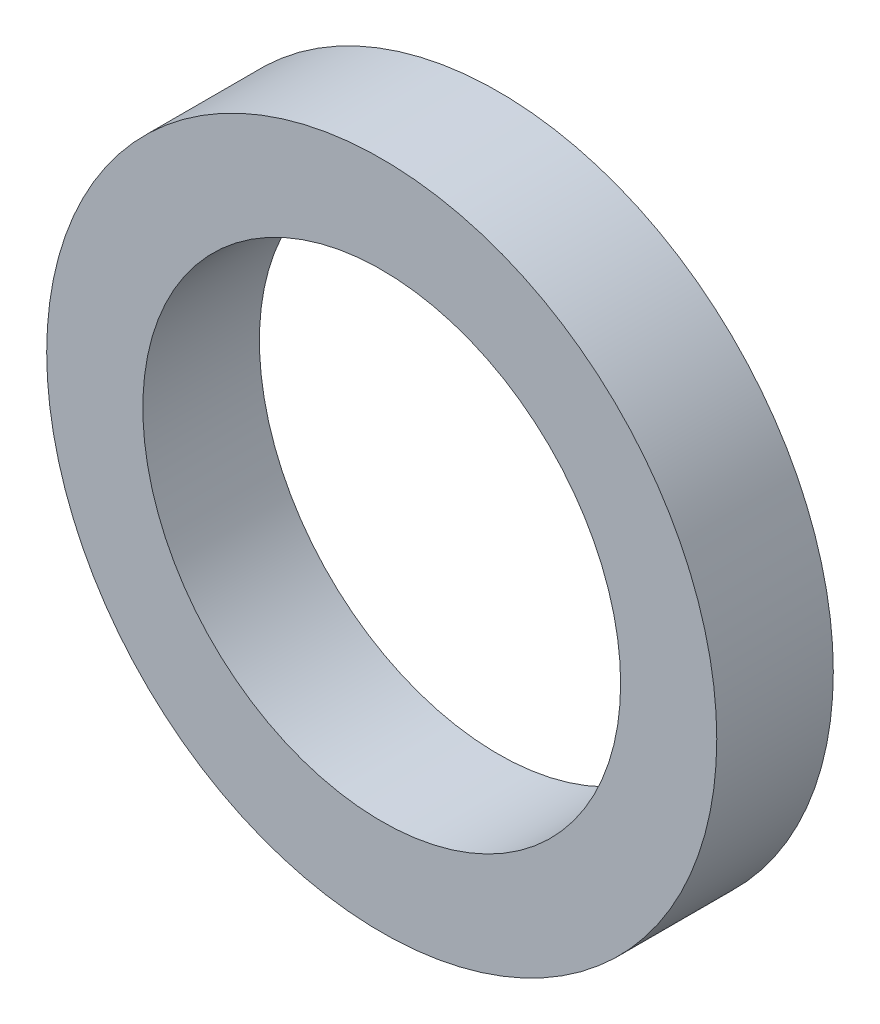
ISO-10303-21;
HEADER;
FILE_DESCRIPTION(('STEP AP214'),'2;1');
FILE_NAME('part.step','',(''),(''),'','','');
FILE_SCHEMA(('AUTOMOTIVE_DESIGN { 1 0 10303 214 1 1 1 1 }'));
ENDSEC;
DATA;
#1=APPLICATION_CONTEXT('core data for automotive mechanical design processes');
#2=APPLICATION_PROTOCOL_DEFINITION('international standard','automotive_design',2000,#1);
#3=PRODUCT_CONTEXT('',#1,'mechanical');
#4=PRODUCT('Part','Part','',(#3));
#5=PRODUCT_RELATED_PRODUCT_CATEGORY('part','',(#4));
#6=PRODUCT_DEFINITION_FORMATION('','',#4);
#7=PRODUCT_DEFINITION_CONTEXT('part definition',#1,'design');
#8=PRODUCT_DEFINITION('design','',#6,#7);
#9=PRODUCT_DEFINITION_SHAPE('','',#8);
#10=(LENGTH_UNIT() NAMED_UNIT(*) SI_UNIT(.MILLI.,.METRE.));
#11=(NAMED_UNIT(*) PLANE_ANGLE_UNIT() SI_UNIT($,.RADIAN.));
#12=(NAMED_UNIT(*) SI_UNIT($,.STERADIAN.) SOLID_ANGLE_UNIT());
#13=UNCERTAINTY_MEASURE_WITH_UNIT(LENGTH_MEASURE(1.E-05),#10,'distance_accuracy_value','');
#14=(GEOMETRIC_REPRESENTATION_CONTEXT(3) GLOBAL_UNCERTAINTY_ASSIGNED_CONTEXT((#13)) GLOBAL_UNIT_ASSIGNED_CONTEXT((#10,
#11,#12)) REPRESENTATION_CONTEXT('',''));
#15=CARTESIAN_POINT('',(0.,0.,0.));
#16=DIRECTION('',(0.,0.,1.));
#17=DIRECTION('',(1.,0.,0.));
#18=AXIS2_PLACEMENT_3D('',#15,#16,#17);
#19=CARTESIAN_POINT('',(0.,0.,2.));
#20=DIRECTION('',(0.,0.,1.));
#21=DIRECTION('',(1.,0.,0.));
#22=AXIS2_PLACEMENT_3D('',#19,#20,#21);
#23=PLANE('',#22);
#24=CARTESIAN_POINT('',(0.,0.,2.));
#25=DIRECTION('',(0.,0.,1.));
#26=DIRECTION('',(1.,0.,0.));
#27=AXIS2_PLACEMENT_3D('',#24,#25,#26);
#28=CIRCLE('',#27,5.75);
#29=CARTESIAN_POINT('',(5.75,0.,2.));
#30=VERTEX_POINT('',#29);
#31=EDGE_CURVE('E10',#30,#30,#28,.T.);
#32=ORIENTED_EDGE('',*,*,#31,.T.);
#33=EDGE_LOOP('',(#32));
#34=FACE_BOUND('',#33,.T.);
#35=CARTESIAN_POINT('',(0.,0.,2.));
#36=DIRECTION('',(0.,0.,1.));
#37=DIRECTION('',(1.,0.,0.));
#38=AXIS2_PLACEMENT_3D('',#35,#36,#37);
#39=CIRCLE('',#38,4.1);
#40=CARTESIAN_POINT('',(4.1,0.,2.));
#41=VERTEX_POINT('',#40);
#42=EDGE_CURVE('E48',#41,#41,#39,.T.);
#43=ORIENTED_EDGE('',*,*,#42,.F.);
#44=EDGE_LOOP('',(#43));
#45=FACE_BOUND('',#44,.T.);
#46=ADVANCED_FACE('F37',(#34,#45),#23,.T.);
#47=CARTESIAN_POINT('',(0.,0.,0.));
#48=DIRECTION('',(0.,0.,1.));
#49=DIRECTION('',(1.,0.,0.));
#50=AXIS2_PLACEMENT_3D('',#47,#48,#49);
#51=PLANE('',#50);
#52=CARTESIAN_POINT('',(0.,0.,0.));
#53=DIRECTION('',(0.,0.,1.));
#54=DIRECTION('',(1.,0.,0.));
#55=AXIS2_PLACEMENT_3D('',#52,#53,#54);
#56=CIRCLE('',#55,5.75);
#57=CARTESIAN_POINT('',(5.75,0.,0.));
#58=VERTEX_POINT('',#57);
#59=EDGE_CURVE('E41',#58,#58,#56,.T.);
#60=ORIENTED_EDGE('',*,*,#59,.F.);
#61=EDGE_LOOP('',(#60));
#62=FACE_BOUND('',#61,.T.);
#63=CARTESIAN_POINT('',(0.,0.,0.));
#64=DIRECTION('',(0.,0.,1.));
#65=DIRECTION('',(1.,0.,0.));
#66=AXIS2_PLACEMENT_3D('',#63,#64,#65);
#67=CIRCLE('',#66,4.1);
#68=CARTESIAN_POINT('',(4.1,0.,0.));
#69=VERTEX_POINT('',#68);
#70=EDGE_CURVE('E50',#69,#69,#67,.T.);
#71=ORIENTED_EDGE('',*,*,#70,.T.);
#72=EDGE_LOOP('',(#71));
#73=FACE_BOUND('',#72,.T.);
#74=ADVANCED_FACE('F60',(#62,#73),#51,.F.);
#75=CARTESIAN_POINT('',(0.,0.,2.));
#76=DIRECTION('',(0.,0.,-1.));
#77=DIRECTION('',(-1.,0.,0.));
#78=AXIS2_PLACEMENT_3D('',#75,#76,#77);
#79=CYLINDRICAL_SURFACE('',#78,5.75);
#80=ORIENTED_EDGE('',*,*,#31,.F.);
#81=EDGE_LOOP('',(#80));
#82=FACE_BOUND('',#81,.T.);
#83=ORIENTED_EDGE('',*,*,#59,.T.);
#84=EDGE_LOOP('',(#83));
#85=FACE_BOUND('',#84,.T.);
#86=ADVANCED_FACE('F39',(#82,#85),#79,.T.);
#87=CARTESIAN_POINT('',(0.,0.,2.));
#88=DIRECTION('',(0.,0.,-1.));
#89=DIRECTION('',(-1.,0.,0.));
#90=AXIS2_PLACEMENT_3D('',#87,#88,#89);
#91=CYLINDRICAL_SURFACE('',#90,4.1);
#92=ORIENTED_EDGE('',*,*,#42,.T.);
#93=EDGE_LOOP('',(#92));
#94=FACE_BOUND('',#93,.T.);
#95=ORIENTED_EDGE('',*,*,#70,.F.);
#96=EDGE_LOOP('',(#95));
#97=FACE_BOUND('',#96,.T.);
#98=ADVANCED_FACE('F56',(#94,#97),#91,.F.);
#99=CLOSED_SHELL('',(#46,#74,#86,#98));
#100=MANIFOLD_SOLID_BREP('B2',#99);
#101=ADVANCED_BREP_SHAPE_REPRESENTATION('',(#18,#100),#14);
#102=SHAPE_DEFINITION_REPRESENTATION(#9,#101);
ENDSEC;
END-ISO-10303-21;
